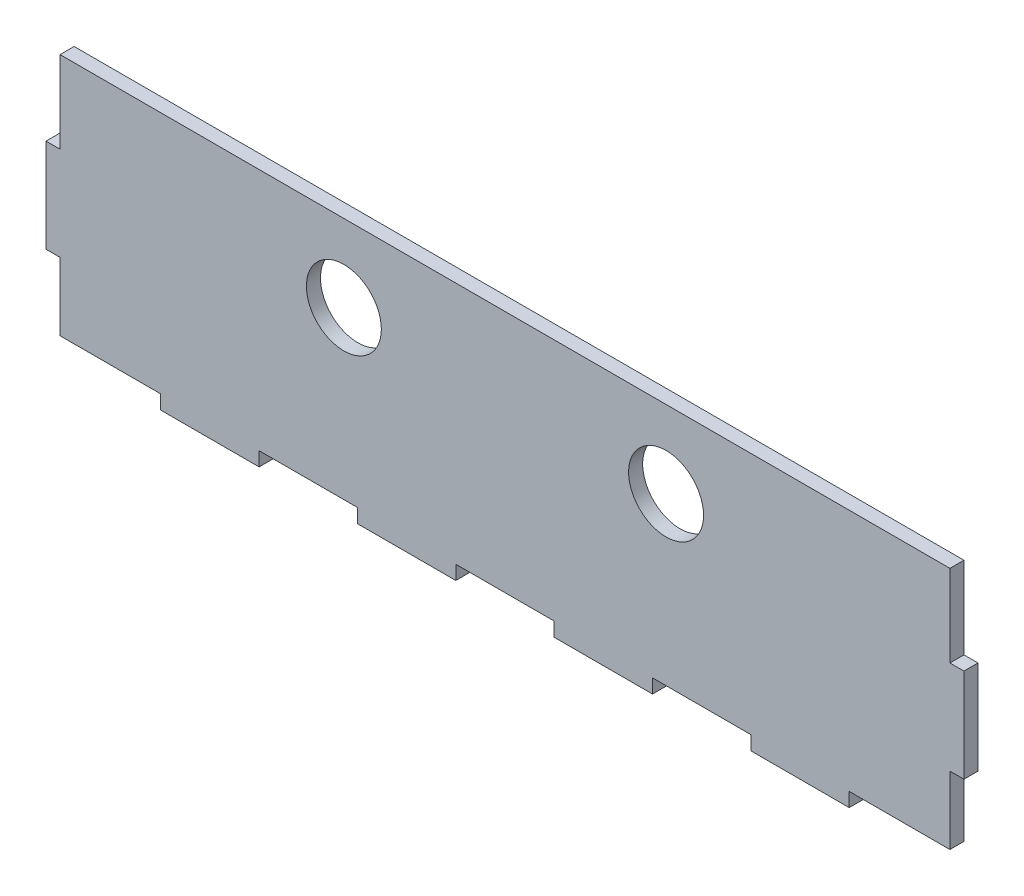
ISO-10303-21;
HEADER;
FILE_DESCRIPTION(('STEP AP214'),'2;1');
FILE_NAME('part.step','',(''),(''),'','','');
FILE_SCHEMA(('AUTOMOTIVE_DESIGN { 1 0 10303 214 1 1 1 1 }'));
ENDSEC;
DATA;
#1=APPLICATION_CONTEXT('core data for automotive mechanical design processes');
#2=APPLICATION_PROTOCOL_DEFINITION('international standard','automotive_design',2000,#1);
#3=PRODUCT_CONTEXT('',#1,'mechanical');
#4=PRODUCT('Part','Part','',(#3));
#5=PRODUCT_RELATED_PRODUCT_CATEGORY('part','',(#4));
#6=PRODUCT_DEFINITION_FORMATION('','',#4);
#7=PRODUCT_DEFINITION_CONTEXT('part definition',#1,'design');
#8=PRODUCT_DEFINITION('design','',#6,#7);
#9=PRODUCT_DEFINITION_SHAPE('','',#8);
#10=(LENGTH_UNIT() NAMED_UNIT(*) SI_UNIT(.MILLI.,.METRE.));
#11=(NAMED_UNIT(*) PLANE_ANGLE_UNIT() SI_UNIT($,.RADIAN.));
#12=(NAMED_UNIT(*) SI_UNIT($,.STERADIAN.) SOLID_ANGLE_UNIT());
#13=UNCERTAINTY_MEASURE_WITH_UNIT(LENGTH_MEASURE(1.E-05),#10,'distance_accuracy_value','');
#14=(GEOMETRIC_REPRESENTATION_CONTEXT(3) GLOBAL_UNCERTAINTY_ASSIGNED_CONTEXT((#13)) GLOBAL_UNIT_ASSIGNED_CONTEXT((#10,
#11,#12)) REPRESENTATION_CONTEXT('',''));
#15=CARTESIAN_POINT('',(0.,0.,0.));
#16=DIRECTION('',(0.,0.,1.));
#17=DIRECTION('',(1.,0.,0.));
#18=AXIS2_PLACEMENT_3D('',#15,#16,#17);
#19=CARTESIAN_POINT('',(95.,0.,3.));
#20=DIRECTION('',(1.,0.,0.));
#21=DIRECTION('',(0.,0.,-1.));
#22=AXIS2_PLACEMENT_3D('',#19,#20,#21);
#23=PLANE('',#22);
#24=DIRECTION('',(0.,-1.,0.));
#25=VECTOR('',#24,1.);
#26=CARTESIAN_POINT('',(95.,0.,0.));
#27=LINE('',#26,#25);
#28=CARTESIAN_POINT('',(95.,-10.,0.));
#29=VERTEX_POINT('',#28);
#30=CARTESIAN_POINT('',(95.,-24.5,0.));
#31=VERTEX_POINT('',#30);
#32=EDGE_CURVE('E321',#29,#31,#27,.T.);
#33=ORIENTED_EDGE('',*,*,#32,.F.);
#34=DIRECTION('',(0.,0.,-1.));
#35=VECTOR('',#34,1.);
#36=CARTESIAN_POINT('',(95.,-10.,3.));
#37=LINE('',#36,#35);
#38=CARTESIAN_POINT('',(95.,-10.,3.));
#39=VERTEX_POINT('',#38);
#40=EDGE_CURVE('E11',#39,#29,#37,.T.);
#41=ORIENTED_EDGE('',*,*,#40,.F.);
#42=DIRECTION('',(0.,-1.,0.));
#43=VECTOR('',#42,1.);
#44=CARTESIAN_POINT('',(95.,0.,3.));
#45=LINE('',#44,#43);
#46=CARTESIAN_POINT('',(95.,-24.5,3.));
#47=VERTEX_POINT('',#46);
#48=EDGE_CURVE('E514',#39,#47,#45,.T.);
#49=ORIENTED_EDGE('',*,*,#48,.T.);
#50=DIRECTION('',(0.,0.,-1.));
#51=VECTOR('',#50,1.);
#52=CARTESIAN_POINT('',(95.,-24.5,3.));
#53=LINE('',#52,#51);
#54=EDGE_CURVE('E145',#47,#31,#53,.T.);
#55=ORIENTED_EDGE('',*,*,#54,.T.);
#56=EDGE_LOOP('',(#33,#41,#49,#55));
#57=FACE_BOUND('',#56,.T.);
#58=ADVANCED_FACE('F34',(#57),#23,.T.);
#59=CARTESIAN_POINT('',(0.,-10.,3.));
#60=DIRECTION('',(0.,-1.,0.));
#61=DIRECTION('',(0.,0.,-1.));
#62=AXIS2_PLACEMENT_3D('',#59,#60,#61);
#63=PLANE('',#62);
#64=DIRECTION('',(-1.,0.,0.));
#65=VECTOR('',#64,1.);
#66=CARTESIAN_POINT('',(0.,-10.,0.));
#67=LINE('',#66,#65);
#68=CARTESIAN_POINT('',(98.,-10.,0.));
#69=VERTEX_POINT('',#68);
#70=EDGE_CURVE('E315',#69,#29,#67,.T.);
#71=ORIENTED_EDGE('',*,*,#70,.F.);
#72=DIRECTION('',(0.,0.,-1.));
#73=VECTOR('',#72,1.);
#74=CARTESIAN_POINT('',(98.,-10.,3.));
#75=LINE('',#74,#73);
#76=CARTESIAN_POINT('',(98.,-10.,3.));
#77=VERTEX_POINT('',#76);
#78=EDGE_CURVE('E43',#77,#69,#75,.T.);
#79=ORIENTED_EDGE('',*,*,#78,.F.);
#80=DIRECTION('',(-1.,0.,0.));
#81=VECTOR('',#80,1.);
#82=CARTESIAN_POINT('',(0.,-10.,3.));
#83=LINE('',#82,#81);
#84=EDGE_CURVE('E516',#77,#39,#83,.T.);
#85=ORIENTED_EDGE('',*,*,#84,.T.);
#86=ORIENTED_EDGE('',*,*,#40,.T.);
#87=EDGE_LOOP('',(#71,#79,#85,#86));
#88=FACE_BOUND('',#87,.T.);
#89=ADVANCED_FACE('F320',(#88),#63,.T.);
#90=CARTESIAN_POINT('',(98.,0.,3.));
#91=DIRECTION('',(-1.,0.,0.));
#92=DIRECTION('',(0.,0.,1.));
#93=AXIS2_PLACEMENT_3D('',#90,#91,#92);
#94=PLANE('',#93);
#95=DIRECTION('',(0.,1.,0.));
#96=VECTOR('',#95,1.);
#97=CARTESIAN_POINT('',(98.,0.,0.));
#98=LINE('',#97,#96);
#99=CARTESIAN_POINT('',(98.,9.99999999999999,0.));
#100=VERTEX_POINT('',#99);
#101=EDGE_CURVE('E306',#69,#100,#98,.T.);
#102=ORIENTED_EDGE('',*,*,#101,.T.);
#103=DIRECTION('',(0.,0.,-1.));
#104=VECTOR('',#103,1.);
#105=CARTESIAN_POINT('',(98.,9.99999999999999,3.));
#106=LINE('',#105,#104);
#107=CARTESIAN_POINT('',(98.,9.99999999999999,3.));
#108=VERTEX_POINT('',#107);
#109=EDGE_CURVE('E299',#108,#100,#106,.T.);
#110=ORIENTED_EDGE('',*,*,#109,.F.);
#111=DIRECTION('',(0.,1.,0.));
#112=VECTOR('',#111,1.);
#113=CARTESIAN_POINT('',(98.,0.,3.));
#114=LINE('',#113,#112);
#115=EDGE_CURVE('E308',#77,#108,#114,.T.);
#116=ORIENTED_EDGE('',*,*,#115,.F.);
#117=ORIENTED_EDGE('',*,*,#78,.T.);
#118=EDGE_LOOP('',(#102,#110,#116,#117));
#119=FACE_BOUND('',#118,.T.);
#120=ADVANCED_FACE('F304',(#119),#94,.F.);
#121=CARTESIAN_POINT('',(0.,9.99999999999999,3.));
#122=DIRECTION('',(0.,1.,0.));
#123=DIRECTION('',(0.,0.,1.));
#124=AXIS2_PLACEMENT_3D('',#121,#122,#123);
#125=PLANE('',#124);
#126=DIRECTION('',(1.,0.,0.));
#127=VECTOR('',#126,1.);
#128=CARTESIAN_POINT('',(0.,9.99999999999999,0.));
#129=LINE('',#128,#127);
#130=CARTESIAN_POINT('',(95.,9.99999999999999,0.));
#131=VERTEX_POINT('',#130);
#132=EDGE_CURVE('E318',#131,#100,#129,.T.);
#133=ORIENTED_EDGE('',*,*,#132,.F.);
#134=DIRECTION('',(0.,0.,-1.));
#135=VECTOR('',#134,1.);
#136=CARTESIAN_POINT('',(95.,9.99999999999999,3.));
#137=LINE('',#136,#135);
#138=CARTESIAN_POINT('',(95.,9.99999999999999,3.));
#139=VERTEX_POINT('',#138);
#140=EDGE_CURVE('E297',#139,#131,#137,.T.);
#141=ORIENTED_EDGE('',*,*,#140,.F.);
#142=DIRECTION('',(1.,0.,0.));
#143=VECTOR('',#142,1.);
#144=CARTESIAN_POINT('',(0.,9.99999999999999,3.));
#145=LINE('',#144,#143);
#146=EDGE_CURVE('E522',#139,#108,#145,.T.);
#147=ORIENTED_EDGE('',*,*,#146,.T.);
#148=ORIENTED_EDGE('',*,*,#109,.T.);
#149=EDGE_LOOP('',(#133,#141,#147,#148));
#150=FACE_BOUND('',#149,.T.);
#151=ADVANCED_FACE('F418',(#150),#125,.T.);
#152=CARTESIAN_POINT('',(95.,0.,3.));
#153=DIRECTION('',(1.,0.,0.));
#154=DIRECTION('',(0.,0.,-1.));
#155=AXIS2_PLACEMENT_3D('',#152,#153,#154);
#156=PLANE('',#155);
#157=DIRECTION('',(0.,-1.,0.));
#158=VECTOR('',#157,1.);
#159=CARTESIAN_POINT('',(95.,0.,0.));
#160=LINE('',#159,#158);
#161=CARTESIAN_POINT('',(95.,27.5,0.));
#162=VERTEX_POINT('',#161);
#163=EDGE_CURVE('E328',#162,#131,#160,.T.);
#164=ORIENTED_EDGE('',*,*,#163,.F.);
#165=DIRECTION('',(0.,0.,-1.));
#166=VECTOR('',#165,1.);
#167=CARTESIAN_POINT('',(95.,27.5,3.));
#168=LINE('',#167,#166);
#169=CARTESIAN_POINT('',(95.,27.5,3.));
#170=VERTEX_POINT('',#169);
#171=EDGE_CURVE('E295',#170,#162,#168,.T.);
#172=ORIENTED_EDGE('',*,*,#171,.F.);
#173=DIRECTION('',(0.,-1.,0.));
#174=VECTOR('',#173,1.);
#175=CARTESIAN_POINT('',(95.,0.,3.));
#176=LINE('',#175,#174);
#177=EDGE_CURVE('E525',#170,#139,#176,.T.);
#178=ORIENTED_EDGE('',*,*,#177,.T.);
#179=ORIENTED_EDGE('',*,*,#140,.T.);
#180=EDGE_LOOP('',(#164,#172,#178,#179));
#181=FACE_BOUND('',#180,.T.);
#182=ADVANCED_FACE('F421',(#181),#156,.T.);
#183=CARTESIAN_POINT('',(0.,27.5,3.));
#184=DIRECTION('',(0.,1.,0.));
#185=DIRECTION('',(0.,0.,1.));
#186=AXIS2_PLACEMENT_3D('',#183,#184,#185);
#187=PLANE('',#186);
#188=DIRECTION('',(1.,0.,0.));
#189=VECTOR('',#188,1.);
#190=CARTESIAN_POINT('',(0.,27.5,0.));
#191=LINE('',#190,#189);
#192=CARTESIAN_POINT('',(-95.,27.5,0.));
#193=VERTEX_POINT('',#192);
#194=EDGE_CURVE('E330',#193,#162,#191,.T.);
#195=ORIENTED_EDGE('',*,*,#194,.F.);
#196=DIRECTION('',(0.,0.,-1.));
#197=VECTOR('',#196,1.);
#198=CARTESIAN_POINT('',(-95.,27.5,3.));
#199=LINE('',#198,#197);
#200=CARTESIAN_POINT('',(-95.,27.5,3.));
#201=VERTEX_POINT('',#200);
#202=EDGE_CURVE('E293',#201,#193,#199,.T.);
#203=ORIENTED_EDGE('',*,*,#202,.F.);
#204=DIRECTION('',(1.,0.,0.));
#205=VECTOR('',#204,1.);
#206=CARTESIAN_POINT('',(0.,27.5,3.));
#207=LINE('',#206,#205);
#208=EDGE_CURVE('E528',#201,#170,#207,.T.);
#209=ORIENTED_EDGE('',*,*,#208,.T.);
#210=ORIENTED_EDGE('',*,*,#171,.T.);
#211=EDGE_LOOP('',(#195,#203,#209,#210));
#212=FACE_BOUND('',#211,.T.);
#213=ADVANCED_FACE('F425',(#212),#187,.T.);
#214=CARTESIAN_POINT('',(-95.,0.,3.));
#215=DIRECTION('',(-1.,0.,0.));
#216=DIRECTION('',(0.,0.,1.));
#217=AXIS2_PLACEMENT_3D('',#214,#215,#216);
#218=PLANE('',#217);
#219=DIRECTION('',(0.,1.,0.));
#220=VECTOR('',#219,1.);
#221=CARTESIAN_POINT('',(-95.,0.,0.));
#222=LINE('',#221,#220);
#223=CARTESIAN_POINT('',(-95.,10.,0.));
#224=VERTEX_POINT('',#223);
#225=EDGE_CURVE('E333',#224,#193,#222,.T.);
#226=ORIENTED_EDGE('',*,*,#225,.F.);
#227=DIRECTION('',(0.,0.,-1.));
#228=VECTOR('',#227,1.);
#229=CARTESIAN_POINT('',(-95.,10.,3.));
#230=LINE('',#229,#228);
#231=CARTESIAN_POINT('',(-95.,10.,3.));
#232=VERTEX_POINT('',#231);
#233=EDGE_CURVE('E291',#232,#224,#230,.T.);
#234=ORIENTED_EDGE('',*,*,#233,.F.);
#235=DIRECTION('',(0.,1.,0.));
#236=VECTOR('',#235,1.);
#237=CARTESIAN_POINT('',(-95.,0.,3.));
#238=LINE('',#237,#236);
#239=EDGE_CURVE('E531',#232,#201,#238,.T.);
#240=ORIENTED_EDGE('',*,*,#239,.T.);
#241=ORIENTED_EDGE('',*,*,#202,.T.);
#242=EDGE_LOOP('',(#226,#234,#240,#241));
#243=FACE_BOUND('',#242,.T.);
#244=ADVANCED_FACE('F429',(#243),#218,.T.);
#245=CARTESIAN_POINT('',(0.,10.,3.));
#246=DIRECTION('',(0.,1.,0.));
#247=DIRECTION('',(0.,0.,1.));
#248=AXIS2_PLACEMENT_3D('',#245,#246,#247);
#249=PLANE('',#248);
#250=DIRECTION('',(1.,0.,0.));
#251=VECTOR('',#250,1.);
#252=CARTESIAN_POINT('',(0.,10.,0.));
#253=LINE('',#252,#251);
#254=CARTESIAN_POINT('',(-98.,10.,0.));
#255=VERTEX_POINT('',#254);
#256=EDGE_CURVE('E336',#255,#224,#253,.T.);
#257=ORIENTED_EDGE('',*,*,#256,.F.);
#258=DIRECTION('',(0.,0.,-1.));
#259=VECTOR('',#258,1.);
#260=CARTESIAN_POINT('',(-98.,10.,3.));
#261=LINE('',#260,#259);
#262=CARTESIAN_POINT('',(-98.,10.,3.));
#263=VERTEX_POINT('',#262);
#264=EDGE_CURVE('E289',#263,#255,#261,.T.);
#265=ORIENTED_EDGE('',*,*,#264,.F.);
#266=DIRECTION('',(1.,0.,0.));
#267=VECTOR('',#266,1.);
#268=CARTESIAN_POINT('',(0.,10.,3.));
#269=LINE('',#268,#267);
#270=EDGE_CURVE('E534',#263,#232,#269,.T.);
#271=ORIENTED_EDGE('',*,*,#270,.T.);
#272=ORIENTED_EDGE('',*,*,#233,.T.);
#273=EDGE_LOOP('',(#257,#265,#271,#272));
#274=FACE_BOUND('',#273,.T.);
#275=ADVANCED_FACE('F433',(#274),#249,.T.);
#276=CARTESIAN_POINT('',(-98.,0.,3.));
#277=DIRECTION('',(-1.,0.,0.));
#278=DIRECTION('',(0.,0.,1.));
#279=AXIS2_PLACEMENT_3D('',#276,#277,#278);
#280=PLANE('',#279);
#281=DIRECTION('',(0.,1.,0.));
#282=VECTOR('',#281,1.);
#283=CARTESIAN_POINT('',(-98.,0.,0.));
#284=LINE('',#283,#282);
#285=CARTESIAN_POINT('',(-98.,-10.,0.));
#286=VERTEX_POINT('',#285);
#287=EDGE_CURVE('E339',#286,#255,#284,.T.);
#288=ORIENTED_EDGE('',*,*,#287,.F.);
#289=DIRECTION('',(0.,0.,-1.));
#290=VECTOR('',#289,1.);
#291=CARTESIAN_POINT('',(-98.,-10.,3.));
#292=LINE('',#291,#290);
#293=CARTESIAN_POINT('',(-98.,-10.,3.));
#294=VERTEX_POINT('',#293);
#295=EDGE_CURVE('E287',#294,#286,#292,.T.);
#296=ORIENTED_EDGE('',*,*,#295,.F.);
#297=DIRECTION('',(0.,1.,0.));
#298=VECTOR('',#297,1.);
#299=CARTESIAN_POINT('',(-98.,0.,3.));
#300=LINE('',#299,#298);
#301=EDGE_CURVE('E537',#294,#263,#300,.T.);
#302=ORIENTED_EDGE('',*,*,#301,.T.);
#303=ORIENTED_EDGE('',*,*,#264,.T.);
#304=EDGE_LOOP('',(#288,#296,#302,#303));
#305=FACE_BOUND('',#304,.T.);
#306=ADVANCED_FACE('F437',(#305),#280,.T.);
#307=CARTESIAN_POINT('',(0.,-10.,3.));
#308=DIRECTION('',(0.,1.,0.));
#309=DIRECTION('',(0.,0.,1.));
#310=AXIS2_PLACEMENT_3D('',#307,#308,#309);
#311=PLANE('',#310);
#312=DIRECTION('',(1.,0.,0.));
#313=VECTOR('',#312,1.);
#314=CARTESIAN_POINT('',(0.,-10.,0.));
#315=LINE('',#314,#313);
#316=CARTESIAN_POINT('',(-95.,-10.,0.));
#317=VERTEX_POINT('',#316);
#318=EDGE_CURVE('E342',#286,#317,#315,.T.);
#319=ORIENTED_EDGE('',*,*,#318,.T.);
#320=DIRECTION('',(0.,0.,-1.));
#321=VECTOR('',#320,1.);
#322=CARTESIAN_POINT('',(-95.,-10.,3.));
#323=LINE('',#322,#321);
#324=CARTESIAN_POINT('',(-95.,-10.,3.));
#325=VERTEX_POINT('',#324);
#326=EDGE_CURVE('E284',#325,#317,#323,.T.);
#327=ORIENTED_EDGE('',*,*,#326,.F.);
#328=DIRECTION('',(1.,0.,0.));
#329=VECTOR('',#328,1.);
#330=CARTESIAN_POINT('',(0.,-10.,3.));
#331=LINE('',#330,#329);
#332=EDGE_CURVE('E540',#294,#325,#331,.T.);
#333=ORIENTED_EDGE('',*,*,#332,.F.);
#334=ORIENTED_EDGE('',*,*,#295,.T.);
#335=EDGE_LOOP('',(#319,#327,#333,#334));
#336=FACE_BOUND('',#335,.T.);
#337=ADVANCED_FACE('F441',(#336),#311,.F.);
#338=CARTESIAN_POINT('',(-95.,0.,3.));
#339=DIRECTION('',(1.,0.,0.));
#340=DIRECTION('',(0.,0.,-1.));
#341=AXIS2_PLACEMENT_3D('',#338,#339,#340);
#342=PLANE('',#341);
#343=DIRECTION('',(0.,-1.,0.));
#344=VECTOR('',#343,1.);
#345=CARTESIAN_POINT('',(-95.,0.,0.));
#346=LINE('',#345,#344);
#347=CARTESIAN_POINT('',(-95.,-24.5,0.));
#348=VERTEX_POINT('',#347);
#349=EDGE_CURVE('E345',#317,#348,#346,.T.);
#350=ORIENTED_EDGE('',*,*,#349,.T.);
#351=DIRECTION('',(0.,0.,-1.));
#352=VECTOR('',#351,1.);
#353=CARTESIAN_POINT('',(-95.,-24.5,3.));
#354=LINE('',#353,#352);
#355=CARTESIAN_POINT('',(-95.,-24.5,3.));
#356=VERTEX_POINT('',#355);
#357=EDGE_CURVE('E282',#356,#348,#354,.T.);
#358=ORIENTED_EDGE('',*,*,#357,.F.);
#359=DIRECTION('',(0.,-1.,0.));
#360=VECTOR('',#359,1.);
#361=CARTESIAN_POINT('',(-95.,0.,3.));
#362=LINE('',#361,#360);
#363=EDGE_CURVE('E543',#325,#356,#362,.T.);
#364=ORIENTED_EDGE('',*,*,#363,.F.);
#365=ORIENTED_EDGE('',*,*,#326,.T.);
#366=EDGE_LOOP('',(#350,#358,#364,#365));
#367=FACE_BOUND('',#366,.T.);
#368=ADVANCED_FACE('F445',(#367),#342,.F.);
#369=CARTESIAN_POINT('',(0.,-24.5,3.));
#370=DIRECTION('',(0.,-1.,0.));
#371=DIRECTION('',(1.,0.,0.));
#372=AXIS2_PLACEMENT_3D('',#369,#370,#371);
#373=PLANE('',#372);
#374=DIRECTION('',(-1.,0.,0.));
#375=VECTOR('',#374,1.);
#376=CARTESIAN_POINT('',(0.,-24.5,0.));
#377=LINE('',#376,#375);
#378=CARTESIAN_POINT('',(-73.5,-24.5,0.));
#379=VERTEX_POINT('',#378);
#380=EDGE_CURVE('E348',#379,#348,#377,.T.);
#381=ORIENTED_EDGE('',*,*,#380,.F.);
#382=DIRECTION('',(0.,0.,-1.));
#383=VECTOR('',#382,1.);
#384=CARTESIAN_POINT('',(-73.5,-24.5,3.));
#385=LINE('',#384,#383);
#386=CARTESIAN_POINT('',(-73.5,-24.5,3.));
#387=VERTEX_POINT('',#386);
#388=EDGE_CURVE('E280',#387,#379,#385,.T.);
#389=ORIENTED_EDGE('',*,*,#388,.F.);
#390=DIRECTION('',(-1.,0.,0.));
#391=VECTOR('',#390,1.);
#392=CARTESIAN_POINT('',(0.,-24.5,3.));
#393=LINE('',#392,#391);
#394=EDGE_CURVE('E545',#387,#356,#393,.T.);
#395=ORIENTED_EDGE('',*,*,#394,.T.);
#396=ORIENTED_EDGE('',*,*,#357,.T.);
#397=EDGE_LOOP('',(#381,#389,#395,#396));
#398=FACE_BOUND('',#397,.T.);
#399=ADVANCED_FACE('F449',(#398),#373,.T.);
#400=CARTESIAN_POINT('',(-73.5,0.,3.));
#401=DIRECTION('',(-1.,0.,0.));
#402=DIRECTION('',(0.,0.,1.));
#403=AXIS2_PLACEMENT_3D('',#400,#401,#402);
#404=PLANE('',#403);
#405=DIRECTION('',(0.,1.,0.));
#406=VECTOR('',#405,1.);
#407=CARTESIAN_POINT('',(-73.5,0.,0.));
#408=LINE('',#407,#406);
#409=CARTESIAN_POINT('',(-73.5,-27.5,0.));
#410=VERTEX_POINT('',#409);
#411=EDGE_CURVE('E351',#410,#379,#408,.T.);
#412=ORIENTED_EDGE('',*,*,#411,.F.);
#413=DIRECTION('',(0.,0.,-1.));
#414=VECTOR('',#413,1.);
#415=CARTESIAN_POINT('',(-73.5,-27.5,3.));
#416=LINE('',#415,#414);
#417=CARTESIAN_POINT('',(-73.5,-27.5,3.));
#418=VERTEX_POINT('',#417);
#419=EDGE_CURVE('E278',#418,#410,#416,.T.);
#420=ORIENTED_EDGE('',*,*,#419,.F.);
#421=DIRECTION('',(0.,1.,0.));
#422=VECTOR('',#421,1.);
#423=CARTESIAN_POINT('',(-73.5,0.,3.));
#424=LINE('',#423,#422);
#425=EDGE_CURVE('E548',#418,#387,#424,.T.);
#426=ORIENTED_EDGE('',*,*,#425,.T.);
#427=ORIENTED_EDGE('',*,*,#388,.T.);
#428=EDGE_LOOP('',(#412,#420,#426,#427));
#429=FACE_BOUND('',#428,.T.);
#430=ADVANCED_FACE('F453',(#429),#404,.T.);
#431=CARTESIAN_POINT('',(0.,-27.5,3.));
#432=DIRECTION('',(0.,1.,0.));
#433=DIRECTION('',(0.,0.,1.));
#434=AXIS2_PLACEMENT_3D('',#431,#432,#433);
#435=PLANE('',#434);
#436=DIRECTION('',(1.,0.,0.));
#437=VECTOR('',#436,1.);
#438=CARTESIAN_POINT('',(0.,-27.5,0.));
#439=LINE('',#438,#437);
#440=CARTESIAN_POINT('',(-52.5,-27.5,0.));
#441=VERTEX_POINT('',#440);
#442=EDGE_CURVE('E354',#410,#441,#439,.T.);
#443=ORIENTED_EDGE('',*,*,#442,.T.);
#444=DIRECTION('',(0.,0.,-1.));
#445=VECTOR('',#444,1.);
#446=CARTESIAN_POINT('',(-52.5,-27.5,3.));
#447=LINE('',#446,#445);
#448=CARTESIAN_POINT('',(-52.5,-27.5,3.));
#449=VERTEX_POINT('',#448);
#450=EDGE_CURVE('E276',#449,#441,#447,.T.);
#451=ORIENTED_EDGE('',*,*,#450,.F.);
#452=DIRECTION('',(1.,0.,0.));
#453=VECTOR('',#452,1.);
#454=CARTESIAN_POINT('',(0.,-27.5,3.));
#455=LINE('',#454,#453);
#456=EDGE_CURVE('E243',#418,#449,#455,.T.);
#457=ORIENTED_EDGE('',*,*,#456,.F.);
#458=ORIENTED_EDGE('',*,*,#419,.T.);
#459=EDGE_LOOP('',(#443,#451,#457,#458));
#460=FACE_BOUND('',#459,.T.);
#461=ADVANCED_FACE('F457',(#460),#435,.F.);
#462=CARTESIAN_POINT('',(-52.5,0.,3.));
#463=DIRECTION('',(1.,0.,0.));
#464=DIRECTION('',(0.,0.,-1.));
#465=AXIS2_PLACEMENT_3D('',#462,#463,#464);
#466=PLANE('',#465);
#467=DIRECTION('',(0.,-1.,0.));
#468=VECTOR('',#467,1.);
#469=CARTESIAN_POINT('',(-52.5,0.,0.));
#470=LINE('',#469,#468);
#471=CARTESIAN_POINT('',(-52.5,-24.5,0.));
#472=VERTEX_POINT('',#471);
#473=EDGE_CURVE('E357',#472,#441,#470,.T.);
#474=ORIENTED_EDGE('',*,*,#473,.F.);
#475=DIRECTION('',(0.,0.,-1.));
#476=VECTOR('',#475,1.);
#477=CARTESIAN_POINT('',(-52.5,-24.5,3.));
#478=LINE('',#477,#476);
#479=CARTESIAN_POINT('',(-52.5,-24.5,3.));
#480=VERTEX_POINT('',#479);
#481=EDGE_CURVE('E274',#480,#472,#478,.T.);
#482=ORIENTED_EDGE('',*,*,#481,.F.);
#483=DIRECTION('',(0.,-1.,0.));
#484=VECTOR('',#483,1.);
#485=CARTESIAN_POINT('',(-52.5,0.,3.));
#486=LINE('',#485,#484);
#487=EDGE_CURVE('E551',#480,#449,#486,.T.);
#488=ORIENTED_EDGE('',*,*,#487,.T.);
#489=ORIENTED_EDGE('',*,*,#450,.T.);
#490=EDGE_LOOP('',(#474,#482,#488,#489));
#491=FACE_BOUND('',#490,.T.);
#492=ADVANCED_FACE('F459',(#491),#466,.T.);
#493=CARTESIAN_POINT('',(0.,-24.5,3.));
#494=DIRECTION('',(0.,-1.,0.));
#495=DIRECTION('',(1.,0.,0.));
#496=AXIS2_PLACEMENT_3D('',#493,#494,#495);
#497=PLANE('',#496);
#498=DIRECTION('',(-1.,0.,0.));
#499=VECTOR('',#498,1.);
#500=CARTESIAN_POINT('',(0.,-24.5,0.));
#501=LINE('',#500,#499);
#502=CARTESIAN_POINT('',(-31.5,-24.5,0.));
#503=VERTEX_POINT('',#502);
#504=EDGE_CURVE('E361',#503,#472,#501,.T.);
#505=ORIENTED_EDGE('',*,*,#504,.F.);
#506=DIRECTION('',(0.,0.,-1.));
#507=VECTOR('',#506,1.);
#508=CARTESIAN_POINT('',(-31.5,-24.5,3.));
#509=LINE('',#508,#507);
#510=CARTESIAN_POINT('',(-31.5,-24.5,3.));
#511=VERTEX_POINT('',#510);
#512=EDGE_CURVE('E272',#511,#503,#509,.T.);
#513=ORIENTED_EDGE('',*,*,#512,.F.);
#514=DIRECTION('',(-1.,0.,0.));
#515=VECTOR('',#514,1.);
#516=CARTESIAN_POINT('',(0.,-24.5,3.));
#517=LINE('',#516,#515);
#518=EDGE_CURVE('E555',#511,#480,#517,.T.);
#519=ORIENTED_EDGE('',*,*,#518,.T.);
#520=ORIENTED_EDGE('',*,*,#481,.T.);
#521=EDGE_LOOP('',(#505,#513,#519,#520));
#522=FACE_BOUND('',#521,.T.);
#523=ADVANCED_FACE('F462',(#522),#497,.T.);
#524=CARTESIAN_POINT('',(-31.5,0.,3.));
#525=DIRECTION('',(-1.,0.,0.));
#526=DIRECTION('',(0.,0.,1.));
#527=AXIS2_PLACEMENT_3D('',#524,#525,#526);
#528=PLANE('',#527);
#529=DIRECTION('',(0.,1.,0.));
#530=VECTOR('',#529,1.);
#531=CARTESIAN_POINT('',(-31.5,0.,0.));
#532=LINE('',#531,#530);
#533=CARTESIAN_POINT('',(-31.5,-27.5,0.));
#534=VERTEX_POINT('',#533);
#535=EDGE_CURVE('E364',#534,#503,#532,.T.);
#536=ORIENTED_EDGE('',*,*,#535,.F.);
#537=DIRECTION('',(0.,0.,-1.));
#538=VECTOR('',#537,1.);
#539=CARTESIAN_POINT('',(-31.5,-27.5,3.));
#540=LINE('',#539,#538);
#541=CARTESIAN_POINT('',(-31.5,-27.5,3.));
#542=VERTEX_POINT('',#541);
#543=EDGE_CURVE('E270',#542,#534,#540,.T.);
#544=ORIENTED_EDGE('',*,*,#543,.F.);
#545=DIRECTION('',(0.,1.,0.));
#546=VECTOR('',#545,1.);
#547=CARTESIAN_POINT('',(-31.5,0.,3.));
#548=LINE('',#547,#546);
#549=EDGE_CURVE('E558',#542,#511,#548,.T.);
#550=ORIENTED_EDGE('',*,*,#549,.T.);
#551=ORIENTED_EDGE('',*,*,#512,.T.);
#552=EDGE_LOOP('',(#536,#544,#550,#551));
#553=FACE_BOUND('',#552,.T.);
#554=ADVANCED_FACE('F466',(#553),#528,.T.);
#555=CARTESIAN_POINT('',(-10.5,-27.5,0.));
#556=VERTEX_POINT('',#555);
#557=EDGE_CURVE('E358',#534,#556,#439,.T.);
#558=ORIENTED_EDGE('',*,*,#557,.T.);
#559=DIRECTION('',(0.,0.,-1.));
#560=VECTOR('',#559,1.);
#561=CARTESIAN_POINT('',(-10.5,-27.5,3.));
#562=LINE('',#561,#560);
#563=CARTESIAN_POINT('',(-10.5,-27.5,3.));
#564=VERTEX_POINT('',#563);
#565=EDGE_CURVE('E268',#564,#556,#562,.T.);
#566=ORIENTED_EDGE('',*,*,#565,.F.);
#567=EDGE_CURVE('E552',#542,#564,#455,.T.);
#568=ORIENTED_EDGE('',*,*,#567,.F.);
#569=ORIENTED_EDGE('',*,*,#543,.T.);
#570=EDGE_LOOP('',(#558,#566,#568,#569));
#571=FACE_BOUND('',#570,.T.);
#572=ADVANCED_FACE('F470',(#571),#435,.F.);
#573=CARTESIAN_POINT('',(-10.5,0.,3.));
#574=DIRECTION('',(1.,0.,0.));
#575=DIRECTION('',(0.,1.,0.));
#576=AXIS2_PLACEMENT_3D('',#573,#574,#575);
#577=PLANE('',#576);
#578=DIRECTION('',(0.,-1.,0.));
#579=VECTOR('',#578,1.);
#580=CARTESIAN_POINT('',(-10.5,0.,0.));
#581=LINE('',#580,#579);
#582=CARTESIAN_POINT('',(-10.5,-24.5,0.));
#583=VERTEX_POINT('',#582);
#584=EDGE_CURVE('E367',#583,#556,#581,.T.);
#585=ORIENTED_EDGE('',*,*,#584,.F.);
#586=DIRECTION('',(0.,0.,-1.));
#587=VECTOR('',#586,1.);
#588=CARTESIAN_POINT('',(-10.5,-24.5,3.));
#589=LINE('',#588,#587);
#590=CARTESIAN_POINT('',(-10.5,-24.5,3.));
#591=VERTEX_POINT('',#590);
#592=EDGE_CURVE('E266',#591,#583,#589,.T.);
#593=ORIENTED_EDGE('',*,*,#592,.F.);
#594=DIRECTION('',(0.,-1.,0.));
#595=VECTOR('',#594,1.);
#596=CARTESIAN_POINT('',(-10.5,0.,3.));
#597=LINE('',#596,#595);
#598=EDGE_CURVE('E561',#591,#564,#597,.T.);
#599=ORIENTED_EDGE('',*,*,#598,.T.);
#600=ORIENTED_EDGE('',*,*,#565,.T.);
#601=EDGE_LOOP('',(#585,#593,#599,#600));
#602=FACE_BOUND('',#601,.T.);
#603=ADVANCED_FACE('F472',(#602),#577,.T.);
#604=CARTESIAN_POINT('',(0.,-24.5,3.));
#605=DIRECTION('',(0.,-1.,0.));
#606=DIRECTION('',(1.,0.,0.));
#607=AXIS2_PLACEMENT_3D('',#604,#605,#606);
#608=PLANE('',#607);
#609=DIRECTION('',(-1.,0.,0.));
#610=VECTOR('',#609,1.);
#611=CARTESIAN_POINT('',(0.,-24.5,0.));
#612=LINE('',#611,#610);
#613=CARTESIAN_POINT('',(10.5,-24.5,0.));
#614=VERTEX_POINT('',#613);
#615=EDGE_CURVE('E370',#614,#583,#612,.T.);
#616=ORIENTED_EDGE('',*,*,#615,.F.);
#617=DIRECTION('',(0.,0.,-1.));
#618=VECTOR('',#617,1.);
#619=CARTESIAN_POINT('',(10.5,-24.5,3.));
#620=LINE('',#619,#618);
#621=CARTESIAN_POINT('',(10.5,-24.5,3.));
#622=VERTEX_POINT('',#621);
#623=EDGE_CURVE('E264',#622,#614,#620,.T.);
#624=ORIENTED_EDGE('',*,*,#623,.F.);
#625=DIRECTION('',(-1.,0.,0.));
#626=VECTOR('',#625,1.);
#627=CARTESIAN_POINT('',(0.,-24.5,3.));
#628=LINE('',#627,#626);
#629=EDGE_CURVE('E564',#622,#591,#628,.T.);
#630=ORIENTED_EDGE('',*,*,#629,.T.);
#631=ORIENTED_EDGE('',*,*,#592,.T.);
#632=EDGE_LOOP('',(#616,#624,#630,#631));
#633=FACE_BOUND('',#632,.T.);
#634=ADVANCED_FACE('F475',(#633),#608,.T.);
#635=CARTESIAN_POINT('',(10.5,0.,3.));
#636=DIRECTION('',(1.,0.,0.));
#637=DIRECTION('',(0.,0.,-1.));
#638=AXIS2_PLACEMENT_3D('',#635,#636,#637);
#639=PLANE('',#638);
#640=DIRECTION('',(0.,-1.,0.));
#641=VECTOR('',#640,1.);
#642=CARTESIAN_POINT('',(10.5,0.,0.));
#643=LINE('',#642,#641);
#644=CARTESIAN_POINT('',(10.5,-27.5,0.));
#645=VERTEX_POINT('',#644);
#646=EDGE_CURVE('E373',#614,#645,#643,.T.);
#647=ORIENTED_EDGE('',*,*,#646,.T.);
#648=DIRECTION('',(0.,0.,-1.));
#649=VECTOR('',#648,1.);
#650=CARTESIAN_POINT('',(10.5,-27.5,3.));
#651=LINE('',#650,#649);
#652=CARTESIAN_POINT('',(10.5,-27.5,3.));
#653=VERTEX_POINT('',#652);
#654=EDGE_CURVE('E261',#653,#645,#651,.T.);
#655=ORIENTED_EDGE('',*,*,#654,.F.);
#656=DIRECTION('',(0.,-1.,0.));
#657=VECTOR('',#656,1.);
#658=CARTESIAN_POINT('',(10.5,0.,3.));
#659=LINE('',#658,#657);
#660=EDGE_CURVE('E567',#622,#653,#659,.T.);
#661=ORIENTED_EDGE('',*,*,#660,.F.);
#662=ORIENTED_EDGE('',*,*,#623,.T.);
#663=EDGE_LOOP('',(#647,#655,#661,#662));
#664=FACE_BOUND('',#663,.T.);
#665=ADVANCED_FACE('F479',(#664),#639,.F.);
#666=CARTESIAN_POINT('',(31.5,-27.5,0.));
#667=VERTEX_POINT('',#666);
#668=EDGE_CURVE('E376',#645,#667,#439,.T.);
#669=ORIENTED_EDGE('',*,*,#668,.T.);
#670=DIRECTION('',(0.,0.,-1.));
#671=VECTOR('',#670,1.);
#672=CARTESIAN_POINT('',(31.5,-27.5,3.));
#673=LINE('',#672,#671);
#674=CARTESIAN_POINT('',(31.5,-27.5,3.));
#675=VERTEX_POINT('',#674);
#676=EDGE_CURVE('E258',#675,#667,#673,.T.);
#677=ORIENTED_EDGE('',*,*,#676,.F.);
#678=EDGE_CURVE('E242',#653,#675,#455,.T.);
#679=ORIENTED_EDGE('',*,*,#678,.F.);
#680=ORIENTED_EDGE('',*,*,#654,.T.);
#681=EDGE_LOOP('',(#669,#677,#679,#680));
#682=FACE_BOUND('',#681,.T.);
#683=ADVANCED_FACE('F483',(#682),#435,.F.);
#684=CARTESIAN_POINT('',(31.5,0.,3.));
#685=DIRECTION('',(-1.,0.,0.));
#686=DIRECTION('',(0.,0.,1.));
#687=AXIS2_PLACEMENT_3D('',#684,#685,#686);
#688=PLANE('',#687);
#689=DIRECTION('',(0.,1.,0.));
#690=VECTOR('',#689,1.);
#691=CARTESIAN_POINT('',(31.5,0.,0.));
#692=LINE('',#691,#690);
#693=CARTESIAN_POINT('',(31.5,-24.5,0.));
#694=VERTEX_POINT('',#693);
#695=EDGE_CURVE('E377',#667,#694,#692,.T.);
#696=ORIENTED_EDGE('',*,*,#695,.T.);
#697=DIRECTION('',(0.,0.,-1.));
#698=VECTOR('',#697,1.);
#699=CARTESIAN_POINT('',(31.5,-24.5,3.));
#700=LINE('',#699,#698);
#701=CARTESIAN_POINT('',(31.5,-24.5,3.));
#702=VERTEX_POINT('',#701);
#703=EDGE_CURVE('E255',#702,#694,#700,.T.);
#704=ORIENTED_EDGE('',*,*,#703,.F.);
#705=DIRECTION('',(0.,1.,0.));
#706=VECTOR('',#705,1.);
#707=CARTESIAN_POINT('',(31.5,0.,3.));
#708=LINE('',#707,#706);
#709=EDGE_CURVE('E570',#675,#702,#708,.T.);
#710=ORIENTED_EDGE('',*,*,#709,.F.);
#711=ORIENTED_EDGE('',*,*,#676,.T.);
#712=EDGE_LOOP('',(#696,#704,#710,#711));
#713=FACE_BOUND('',#712,.T.);
#714=ADVANCED_FACE('F485',(#713),#688,.F.);
#715=CARTESIAN_POINT('',(0.,-24.5,3.));
#716=DIRECTION('',(0.,1.,0.));
#717=DIRECTION('',(0.,0.,1.));
#718=AXIS2_PLACEMENT_3D('',#715,#716,#717);
#719=PLANE('',#718);
#720=DIRECTION('',(1.,0.,0.));
#721=VECTOR('',#720,1.);
#722=CARTESIAN_POINT('',(0.,-24.5,0.));
#723=LINE('',#722,#721);
#724=CARTESIAN_POINT('',(52.5,-24.5,0.));
#725=VERTEX_POINT('',#724);
#726=EDGE_CURVE('E380',#694,#725,#723,.T.);
#727=ORIENTED_EDGE('',*,*,#726,.T.);
#728=DIRECTION('',(0.,0.,-1.));
#729=VECTOR('',#728,1.);
#730=CARTESIAN_POINT('',(52.5,-24.5,3.));
#731=LINE('',#730,#729);
#732=CARTESIAN_POINT('',(52.5,-24.5,3.));
#733=VERTEX_POINT('',#732);
#734=EDGE_CURVE('E248',#733,#725,#731,.T.);
#735=ORIENTED_EDGE('',*,*,#734,.F.);
#736=DIRECTION('',(1.,0.,0.));
#737=VECTOR('',#736,1.);
#738=CARTESIAN_POINT('',(0.,-24.5,3.));
#739=LINE('',#738,#737);
#740=EDGE_CURVE('E573',#702,#733,#739,.T.);
#741=ORIENTED_EDGE('',*,*,#740,.F.);
#742=ORIENTED_EDGE('',*,*,#703,.T.);
#743=EDGE_LOOP('',(#727,#735,#741,#742));
#744=FACE_BOUND('',#743,.T.);
#745=ADVANCED_FACE('F488',(#744),#719,.F.);
#746=CARTESIAN_POINT('',(52.5000000000001,-1.21430643318377E-13,3.));
#747=DIRECTION('',(1.,0.,0.));
#748=DIRECTION('',(0.,1.,0.));
#749=AXIS2_PLACEMENT_3D('',#746,#747,#748);
#750=PLANE('',#749);
#751=DIRECTION('',(0.,-1.,0.));
#752=VECTOR('',#751,1.);
#753=CARTESIAN_POINT('',(52.5000000000001,-1.21430643318377E-13,0.));
#754=LINE('',#753,#752);
#755=CARTESIAN_POINT('',(52.5,-27.5,0.));
#756=VERTEX_POINT('',#755);
#757=EDGE_CURVE('E383',#725,#756,#754,.T.);
#758=ORIENTED_EDGE('',*,*,#757,.T.);
#759=DIRECTION('',(0.,0.,-1.));
#760=VECTOR('',#759,1.);
#761=CARTESIAN_POINT('',(52.5,-27.5,3.));
#762=LINE('',#761,#760);
#763=CARTESIAN_POINT('',(52.5,-27.5,3.));
#764=VERTEX_POINT('',#763);
#765=EDGE_CURVE('E246',#764,#756,#762,.T.);
#766=ORIENTED_EDGE('',*,*,#765,.F.);
#767=DIRECTION('',(0.,-1.,0.));
#768=VECTOR('',#767,1.);
#769=CARTESIAN_POINT('',(52.5000000000001,-1.21430643318377E-13,3.));
#770=LINE('',#769,#768);
#771=EDGE_CURVE('E237',#733,#764,#770,.T.);
#772=ORIENTED_EDGE('',*,*,#771,.F.);
#773=ORIENTED_EDGE('',*,*,#734,.T.);
#774=EDGE_LOOP('',(#758,#766,#772,#773));
#775=FACE_BOUND('',#774,.T.);
#776=ADVANCED_FACE('F492',(#775),#750,.F.);
#777=CARTESIAN_POINT('',(73.5,-27.5,0.));
#778=VERTEX_POINT('',#777);
#779=EDGE_CURVE('E245',#756,#778,#439,.T.);
#780=ORIENTED_EDGE('',*,*,#779,.T.);
#781=DIRECTION('',(0.,0.,-1.));
#782=VECTOR('',#781,1.);
#783=CARTESIAN_POINT('',(73.5,-27.5,3.));
#784=LINE('',#783,#782);
#785=CARTESIAN_POINT('',(73.5,-27.5,3.));
#786=VERTEX_POINT('',#785);
#787=EDGE_CURVE('E229',#786,#778,#784,.T.);
#788=ORIENTED_EDGE('',*,*,#787,.F.);
#789=EDGE_CURVE('E232',#764,#786,#455,.T.);
#790=ORIENTED_EDGE('',*,*,#789,.F.);
#791=ORIENTED_EDGE('',*,*,#765,.T.);
#792=EDGE_LOOP('',(#780,#788,#790,#791));
#793=FACE_BOUND('',#792,.T.);
#794=ADVANCED_FACE('F244',(#793),#435,.F.);
#795=CARTESIAN_POINT('',(73.5,0.,3.));
#796=DIRECTION('',(-1.,0.,0.));
#797=DIRECTION('',(0.,0.,1.));
#798=AXIS2_PLACEMENT_3D('',#795,#796,#797);
#799=PLANE('',#798);
#800=DIRECTION('',(0.,1.,0.));
#801=VECTOR('',#800,1.);
#802=CARTESIAN_POINT('',(73.5,0.,0.));
#803=LINE('',#802,#801);
#804=CARTESIAN_POINT('',(73.5,-24.5,0.));
#805=VERTEX_POINT('',#804);
#806=EDGE_CURVE('E386',#778,#805,#803,.T.);
#807=ORIENTED_EDGE('',*,*,#806,.T.);
#808=DIRECTION('',(0.,0.,-1.));
#809=VECTOR('',#808,1.);
#810=CARTESIAN_POINT('',(73.5,-24.5,3.));
#811=LINE('',#810,#809);
#812=CARTESIAN_POINT('',(73.5,-24.5,3.));
#813=VERTEX_POINT('',#812);
#814=EDGE_CURVE('E231',#813,#805,#811,.T.);
#815=ORIENTED_EDGE('',*,*,#814,.F.);
#816=DIRECTION('',(0.,1.,0.));
#817=VECTOR('',#816,1.);
#818=CARTESIAN_POINT('',(73.5,0.,3.));
#819=LINE('',#818,#817);
#820=EDGE_CURVE('E224',#786,#813,#819,.T.);
#821=ORIENTED_EDGE('',*,*,#820,.F.);
#822=ORIENTED_EDGE('',*,*,#787,.T.);
#823=EDGE_LOOP('',(#807,#815,#821,#822));
#824=FACE_BOUND('',#823,.T.);
#825=ADVANCED_FACE('F227',(#824),#799,.F.);
#826=CARTESIAN_POINT('',(-34.4,11.,3.));
#827=DIRECTION('',(0.,0.,-1.));
#828=DIRECTION('',(-1.,0.,0.));
#829=AXIS2_PLACEMENT_3D('',#826,#827,#828);
#830=CYLINDRICAL_SURFACE('',#829,8.);
#831=CARTESIAN_POINT('',(-34.4,11.,3.));
#832=DIRECTION('',(0.,0.,1.));
#833=DIRECTION('',(1.,0.,0.));
#834=AXIS2_PLACEMENT_3D('',#831,#832,#833);
#835=CIRCLE('',#834,8.);
#836=CARTESIAN_POINT('',(-26.4,11.,3.));
#837=VERTEX_POINT('',#836);
#838=EDGE_CURVE('E513',#837,#837,#835,.T.);
#839=ORIENTED_EDGE('',*,*,#838,.T.);
#840=EDGE_LOOP('',(#839));
#841=FACE_BOUND('',#840,.T.);
#842=CARTESIAN_POINT('',(-34.4,11.,0.));
#843=DIRECTION('',(0.,0.,1.));
#844=DIRECTION('',(1.,0.,0.));
#845=AXIS2_PLACEMENT_3D('',#842,#843,#844);
#846=CIRCLE('',#845,8.);
#847=CARTESIAN_POINT('',(-26.4,11.,0.));
#848=VERTEX_POINT('',#847);
#849=EDGE_CURVE('E323',#848,#848,#846,.T.);
#850=ORIENTED_EDGE('',*,*,#849,.F.);
#851=EDGE_LOOP('',(#850));
#852=FACE_BOUND('',#851,.T.);
#853=ADVANCED_FACE('F398',(#841,#852),#830,.F.);
#854=CARTESIAN_POINT('',(34.4,11.,3.));
#855=DIRECTION('',(0.,0.,-1.));
#856=DIRECTION('',(-1.,0.,0.));
#857=AXIS2_PLACEMENT_3D('',#854,#855,#856);
#858=CYLINDRICAL_SURFACE('',#857,8.00000000000002);
#859=CARTESIAN_POINT('',(34.4,11.,3.));
#860=DIRECTION('',(0.,0.,1.));
#861=DIRECTION('',(1.,0.,0.));
#862=AXIS2_PLACEMENT_3D('',#859,#860,#861);
#863=CIRCLE('',#862,8.00000000000002);
#864=CARTESIAN_POINT('',(42.4,11.,3.));
#865=VERTEX_POINT('',#864);
#866=EDGE_CURVE('E388',#865,#865,#863,.T.);
#867=ORIENTED_EDGE('',*,*,#866,.T.);
#868=EDGE_LOOP('',(#867));
#869=FACE_BOUND('',#868,.T.);
#870=CARTESIAN_POINT('',(34.4,11.,0.));
#871=DIRECTION('',(0.,0.,1.));
#872=DIRECTION('',(1.,0.,0.));
#873=AXIS2_PLACEMENT_3D('',#870,#871,#872);
#874=CIRCLE('',#873,8.00000000000002);
#875=CARTESIAN_POINT('',(42.4,11.,0.));
#876=VERTEX_POINT('',#875);
#877=EDGE_CURVE('E392',#876,#876,#874,.T.);
#878=ORIENTED_EDGE('',*,*,#877,.F.);
#879=EDGE_LOOP('',(#878));
#880=FACE_BOUND('',#879,.T.);
#881=ADVANCED_FACE('F36',(#869,#880),#858,.F.);
#882=CARTESIAN_POINT('',(0.,-24.5,3.));
#883=DIRECTION('',(0.,1.,0.));
#884=DIRECTION('',(0.,0.,1.));
#885=AXIS2_PLACEMENT_3D('',#882,#883,#884);
#886=PLANE('',#885);
#887=DIRECTION('',(1.,0.,0.));
#888=VECTOR('',#887,1.);
#889=CARTESIAN_POINT('',(0.,-24.5,0.));
#890=LINE('',#889,#888);
#891=EDGE_CURVE('E138',#805,#31,#890,.T.);
#892=ORIENTED_EDGE('',*,*,#891,.T.);
#893=ORIENTED_EDGE('',*,*,#54,.F.);
#894=DIRECTION('',(1.,0.,0.));
#895=VECTOR('',#894,1.);
#896=CARTESIAN_POINT('',(0.,-24.5,3.));
#897=LINE('',#896,#895);
#898=EDGE_CURVE('E51',#813,#47,#897,.T.);
#899=ORIENTED_EDGE('',*,*,#898,.F.);
#900=ORIENTED_EDGE('',*,*,#814,.T.);
#901=EDGE_LOOP('',(#892,#893,#899,#900));
#902=FACE_BOUND('',#901,.T.);
#903=ADVANCED_FACE('F405',(#902),#886,.F.);
#904=CARTESIAN_POINT('',(0.,0.,3.));
#905=DIRECTION('',(0.,0.,1.));
#906=DIRECTION('',(1.,0.,0.));
#907=AXIS2_PLACEMENT_3D('',#904,#905,#906);
#908=PLANE('',#907);
#909=ORIENTED_EDGE('',*,*,#866,.F.);
#910=EDGE_LOOP('',(#909));
#911=FACE_BOUND('',#910,.T.);
#912=ORIENTED_EDGE('',*,*,#838,.F.);
#913=EDGE_LOOP('',(#912));
#914=FACE_BOUND('',#913,.T.);
#915=ORIENTED_EDGE('',*,*,#48,.F.);
#916=ORIENTED_EDGE('',*,*,#84,.F.);
#917=ORIENTED_EDGE('',*,*,#115,.T.);
#918=ORIENTED_EDGE('',*,*,#146,.F.);
#919=ORIENTED_EDGE('',*,*,#177,.F.);
#920=ORIENTED_EDGE('',*,*,#208,.F.);
#921=ORIENTED_EDGE('',*,*,#239,.F.);
#922=ORIENTED_EDGE('',*,*,#270,.F.);
#923=ORIENTED_EDGE('',*,*,#301,.F.);
#924=ORIENTED_EDGE('',*,*,#332,.T.);
#925=ORIENTED_EDGE('',*,*,#363,.T.);
#926=ORIENTED_EDGE('',*,*,#394,.F.);
#927=ORIENTED_EDGE('',*,*,#425,.F.);
#928=ORIENTED_EDGE('',*,*,#456,.T.);
#929=ORIENTED_EDGE('',*,*,#487,.F.);
#930=ORIENTED_EDGE('',*,*,#518,.F.);
#931=ORIENTED_EDGE('',*,*,#549,.F.);
#932=ORIENTED_EDGE('',*,*,#567,.T.);
#933=ORIENTED_EDGE('',*,*,#598,.F.);
#934=ORIENTED_EDGE('',*,*,#629,.F.);
#935=ORIENTED_EDGE('',*,*,#660,.T.);
#936=ORIENTED_EDGE('',*,*,#678,.T.);
#937=ORIENTED_EDGE('',*,*,#709,.T.);
#938=ORIENTED_EDGE('',*,*,#740,.T.);
#939=ORIENTED_EDGE('',*,*,#771,.T.);
#940=ORIENTED_EDGE('',*,*,#789,.T.);
#941=ORIENTED_EDGE('',*,*,#820,.T.);
#942=ORIENTED_EDGE('',*,*,#898,.T.);
#943=EDGE_LOOP('',(#915,#916,#917,#918,#919,#920,#921,#922,#923,#924,#925,#926,#927,#928,#929,
#930,#931,#932,#933,#934,#935,#936,#937,#938,#939,#940,#941,#942));
#944=FACE_BOUND('',#943,.T.);
#945=ADVANCED_FACE('F235',(#911,#914,#944),#908,.T.);
#946=CARTESIAN_POINT('',(0.,0.,0.));
#947=DIRECTION('',(0.,0.,1.));
#948=DIRECTION('',(1.,0.,0.));
#949=AXIS2_PLACEMENT_3D('',#946,#947,#948);
#950=PLANE('',#949);
#951=ORIENTED_EDGE('',*,*,#877,.T.);
#952=EDGE_LOOP('',(#951));
#953=FACE_BOUND('',#952,.T.);
#954=ORIENTED_EDGE('',*,*,#849,.T.);
#955=EDGE_LOOP('',(#954));
#956=FACE_BOUND('',#955,.T.);
#957=ORIENTED_EDGE('',*,*,#32,.T.);
#958=ORIENTED_EDGE('',*,*,#891,.F.);
#959=ORIENTED_EDGE('',*,*,#806,.F.);
#960=ORIENTED_EDGE('',*,*,#779,.F.);
#961=ORIENTED_EDGE('',*,*,#757,.F.);
#962=ORIENTED_EDGE('',*,*,#726,.F.);
#963=ORIENTED_EDGE('',*,*,#695,.F.);
#964=ORIENTED_EDGE('',*,*,#668,.F.);
#965=ORIENTED_EDGE('',*,*,#646,.F.);
#966=ORIENTED_EDGE('',*,*,#615,.T.);
#967=ORIENTED_EDGE('',*,*,#584,.T.);
#968=ORIENTED_EDGE('',*,*,#557,.F.);
#969=ORIENTED_EDGE('',*,*,#535,.T.);
#970=ORIENTED_EDGE('',*,*,#504,.T.);
#971=ORIENTED_EDGE('',*,*,#473,.T.);
#972=ORIENTED_EDGE('',*,*,#442,.F.);
#973=ORIENTED_EDGE('',*,*,#411,.T.);
#974=ORIENTED_EDGE('',*,*,#380,.T.);
#975=ORIENTED_EDGE('',*,*,#349,.F.);
#976=ORIENTED_EDGE('',*,*,#318,.F.);
#977=ORIENTED_EDGE('',*,*,#287,.T.);
#978=ORIENTED_EDGE('',*,*,#256,.T.);
#979=ORIENTED_EDGE('',*,*,#225,.T.);
#980=ORIENTED_EDGE('',*,*,#194,.T.);
#981=ORIENTED_EDGE('',*,*,#163,.T.);
#982=ORIENTED_EDGE('',*,*,#132,.T.);
#983=ORIENTED_EDGE('',*,*,#101,.F.);
#984=ORIENTED_EDGE('',*,*,#70,.T.);
#985=EDGE_LOOP('',(#957,#958,#959,#960,#961,#962,#963,#964,#965,#966,#967,#968,#969,#970,#971,
#972,#973,#974,#975,#976,#977,#978,#979,#980,#981,#982,#983,#984));
#986=FACE_BOUND('',#985,.T.);
#987=ADVANCED_FACE('F314',(#953,#956,#986),#950,.F.);
#988=CLOSED_SHELL('',(#58,#89,#120,#151,#182,#213,#244,#275,#306,#337,#368,#399,#430,#461,#492,
#523,#554,#572,#603,#634,#665,#683,#714,#745,#776,#794,#825,#853,#881,#903,#945,#987));
#989=MANIFOLD_SOLID_BREP('B2',#988);
#990=ADVANCED_BREP_SHAPE_REPRESENTATION('',(#18,#989),#14);
#991=SHAPE_DEFINITION_REPRESENTATION(#9,#990);
ENDSEC;
END-ISO-10303-21;
